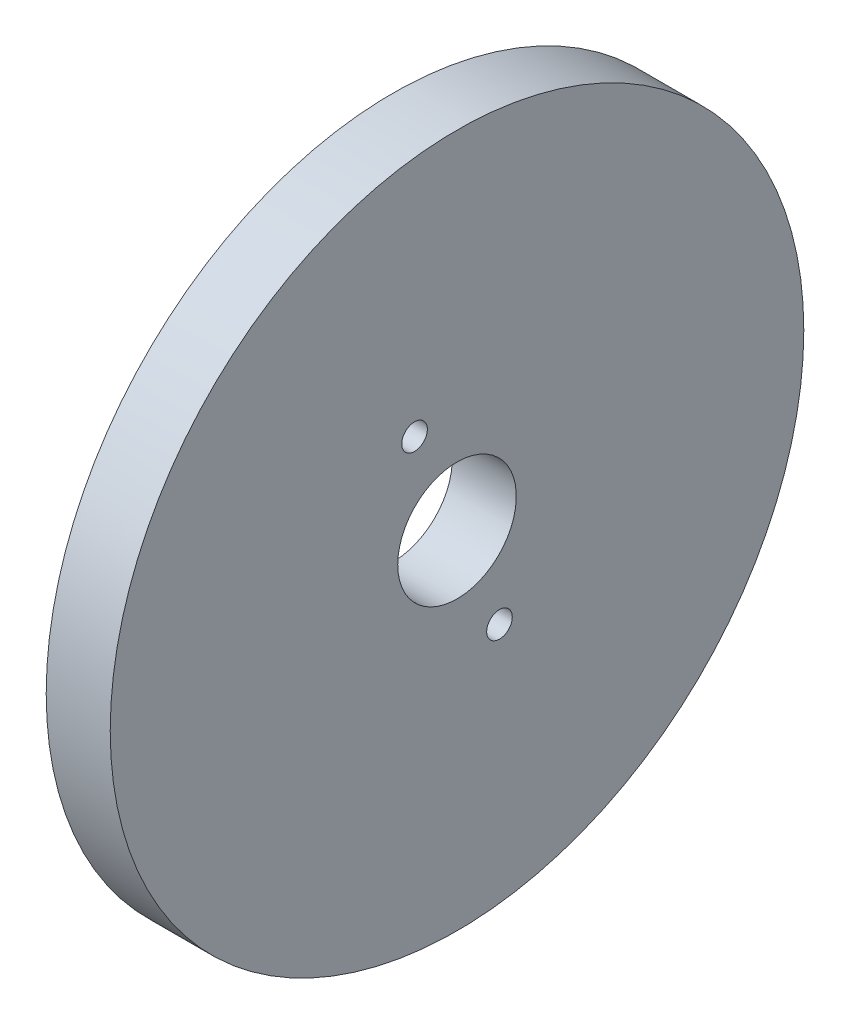
ISO-10303-21;
HEADER;
FILE_DESCRIPTION(('STEP AP214'),'2;1');
FILE_NAME('part.step','',(''),(''),'','','');
FILE_SCHEMA(('AUTOMOTIVE_DESIGN { 1 0 10303 214 1 1 1 1 }'));
ENDSEC;
DATA;
#1=APPLICATION_CONTEXT('core data for automotive mechanical design processes');
#2=APPLICATION_PROTOCOL_DEFINITION('international standard','automotive_design',2000,#1);
#3=PRODUCT_CONTEXT('',#1,'mechanical');
#4=PRODUCT('Part','Part','',(#3));
#5=PRODUCT_RELATED_PRODUCT_CATEGORY('part','',(#4));
#6=PRODUCT_DEFINITION_FORMATION('','',#4);
#7=PRODUCT_DEFINITION_CONTEXT('part definition',#1,'design');
#8=PRODUCT_DEFINITION('design','',#6,#7);
#9=PRODUCT_DEFINITION_SHAPE('','',#8);
#10=(LENGTH_UNIT() NAMED_UNIT(*) SI_UNIT(.MILLI.,.METRE.));
#11=(NAMED_UNIT(*) PLANE_ANGLE_UNIT() SI_UNIT($,.RADIAN.));
#12=(NAMED_UNIT(*) SI_UNIT($,.STERADIAN.) SOLID_ANGLE_UNIT());
#13=UNCERTAINTY_MEASURE_WITH_UNIT(LENGTH_MEASURE(1.E-05),#10,'distance_accuracy_value','');
#14=(GEOMETRIC_REPRESENTATION_CONTEXT(3) GLOBAL_UNCERTAINTY_ASSIGNED_CONTEXT((#13)) GLOBAL_UNIT_ASSIGNED_CONTEXT((#10,
#11,#12)) REPRESENTATION_CONTEXT('',''));
#15=CARTESIAN_POINT('',(0.,0.,0.));
#16=DIRECTION('',(0.,0.,1.));
#17=DIRECTION('',(1.,0.,0.));
#18=AXIS2_PLACEMENT_3D('',#15,#16,#17);
#19=CARTESIAN_POINT('',(13.7,65.,0.));
#20=DIRECTION('',(1.,0.,0.));
#21=DIRECTION('',(0.,0.,-1.));
#22=AXIS2_PLACEMENT_3D('',#19,#20,#21);
#23=PLANE('',#22);
#24=CARTESIAN_POINT('',(13.7,19.2166942762348,7.95981539319387));
#25=DIRECTION('',(1.,0.,0.));
#26=DIRECTION('',(0.,0.,-1.));
#27=AXIS2_PLACEMENT_3D('',#24,#25,#26);
#28=CIRCLE('',#27,2.4);
#29=CARTESIAN_POINT('',(13.7,19.2166942762348,5.55981539319387));
#30=VERTEX_POINT('',#29);
#31=EDGE_CURVE('E60',#30,#30,#28,.F.);
#32=ORIENTED_EDGE('',*,*,#31,.F.);
#33=EDGE_LOOP('',(#32));
#34=FACE_BOUND('',#33,.T.);
#35=CARTESIAN_POINT('',(13.7,-19.2166942762348,-7.95981539319386));
#36=DIRECTION('',(1.,0.,0.));
#37=DIRECTION('',(0.,0.,-1.));
#38=AXIS2_PLACEMENT_3D('',#35,#36,#37);
#39=CIRCLE('',#38,2.4);
#40=CARTESIAN_POINT('',(13.7,-19.2166942762348,-10.3598153931939));
#41=VERTEX_POINT('',#40);
#42=EDGE_CURVE('E64',#41,#41,#39,.F.);
#43=ORIENTED_EDGE('',*,*,#42,.F.);
#44=EDGE_LOOP('',(#43));
#45=FACE_BOUND('',#44,.T.);
#46=CARTESIAN_POINT('',(13.7,0.,0.));
#47=DIRECTION('',(-1.,0.,0.));
#48=DIRECTION('',(0.,0.,1.));
#49=AXIS2_PLACEMENT_3D('',#46,#47,#48);
#50=CIRCLE('',#49,11.1125);
#51=CARTESIAN_POINT('',(13.7,0.,11.1125));
#52=VERTEX_POINT('',#51);
#53=EDGE_CURVE('E10',#52,#52,#50,.T.);
#54=ORIENTED_EDGE('',*,*,#53,.F.);
#55=EDGE_LOOP('',(#54));
#56=FACE_BOUND('',#55,.T.);
#57=CARTESIAN_POINT('',(13.7,0.,0.));
#58=DIRECTION('',(-1.,0.,0.));
#59=DIRECTION('',(0.,0.,1.));
#60=AXIS2_PLACEMENT_3D('',#57,#58,#59);
#61=CIRCLE('',#60,65.);
#62=CARTESIAN_POINT('',(13.7,0.,65.));
#63=VERTEX_POINT('',#62);
#64=EDGE_CURVE('E54',#63,#63,#61,.T.);
#65=ORIENTED_EDGE('',*,*,#64,.T.);
#66=EDGE_LOOP('',(#65));
#67=FACE_BOUND('',#66,.T.);
#68=ADVANCED_FACE('F37',(#34,#45,#56,#67),#23,.F.);
#69=CARTESIAN_POINT('',(-110.,0.,0.));
#70=DIRECTION('',(-1.,0.,0.));
#71=DIRECTION('',(0.,0.,1.));
#72=AXIS2_PLACEMENT_3D('',#69,#70,#71);
#73=CYLINDRICAL_SURFACE('',#72,11.1125);
#74=CARTESIAN_POINT('',(25.7,0.,0.));
#75=DIRECTION('',(-1.,0.,0.));
#76=DIRECTION('',(0.,0.,1.));
#77=AXIS2_PLACEMENT_3D('',#74,#75,#76);
#78=CIRCLE('',#77,11.1125);
#79=CARTESIAN_POINT('',(25.7,0.,11.1125));
#80=VERTEX_POINT('',#79);
#81=EDGE_CURVE('E44',#80,#80,#78,.T.);
#82=ORIENTED_EDGE('',*,*,#81,.F.);
#83=EDGE_LOOP('',(#82));
#84=FACE_BOUND('',#83,.T.);
#85=ORIENTED_EDGE('',*,*,#53,.T.);
#86=EDGE_LOOP('',(#85));
#87=FACE_BOUND('',#86,.T.);
#88=ADVANCED_FACE('F84',(#84,#87),#73,.F.);
#89=CARTESIAN_POINT('',(25.7,11.1125,0.));
#90=DIRECTION('',(-1.,0.,0.));
#91=DIRECTION('',(0.,0.,1.));
#92=AXIS2_PLACEMENT_3D('',#89,#90,#91);
#93=PLANE('',#92);
#94=CARTESIAN_POINT('',(25.7,19.2166942762348,7.95981539319387));
#95=DIRECTION('',(1.,0.,0.));
#96=DIRECTION('',(0.,0.,-1.));
#97=AXIS2_PLACEMENT_3D('',#94,#95,#96);
#98=CIRCLE('',#97,2.4);
#99=CARTESIAN_POINT('',(25.7,19.2166942762348,5.55981539319387));
#100=VERTEX_POINT('',#99);
#101=EDGE_CURVE('E68',#100,#100,#98,.T.);
#102=ORIENTED_EDGE('',*,*,#101,.F.);
#103=EDGE_LOOP('',(#102));
#104=FACE_BOUND('',#103,.T.);
#105=CARTESIAN_POINT('',(25.7,-19.2166942762348,-7.95981539319386));
#106=DIRECTION('',(1.,0.,0.));
#107=DIRECTION('',(0.,0.,-1.));
#108=AXIS2_PLACEMENT_3D('',#105,#106,#107);
#109=CIRCLE('',#108,2.4);
#110=CARTESIAN_POINT('',(25.7,-19.2166942762348,-10.3598153931939));
#111=VERTEX_POINT('',#110);
#112=EDGE_CURVE('E69',#111,#111,#109,.T.);
#113=ORIENTED_EDGE('',*,*,#112,.F.);
#114=EDGE_LOOP('',(#113));
#115=FACE_BOUND('',#114,.T.);
#116=CARTESIAN_POINT('',(25.7,0.,0.));
#117=DIRECTION('',(-1.,0.,0.));
#118=DIRECTION('',(0.,0.,1.));
#119=AXIS2_PLACEMENT_3D('',#116,#117,#118);
#120=CIRCLE('',#119,65.);
#121=CARTESIAN_POINT('',(25.7,0.,65.));
#122=VERTEX_POINT('',#121);
#123=EDGE_CURVE('E49',#122,#122,#120,.T.);
#124=ORIENTED_EDGE('',*,*,#123,.F.);
#125=EDGE_LOOP('',(#124));
#126=FACE_BOUND('',#125,.T.);
#127=ORIENTED_EDGE('',*,*,#81,.T.);
#128=EDGE_LOOP('',(#127));
#129=FACE_BOUND('',#128,.T.);
#130=ADVANCED_FACE('F80',(#104,#115,#126,#129),#93,.F.);
#131=CARTESIAN_POINT('',(-110.,0.,0.));
#132=DIRECTION('',(-1.,0.,0.));
#133=DIRECTION('',(0.,0.,1.));
#134=AXIS2_PLACEMENT_3D('',#131,#132,#133);
#135=CYLINDRICAL_SURFACE('',#134,65.);
#136=ORIENTED_EDGE('',*,*,#64,.F.);
#137=EDGE_LOOP('',(#136));
#138=FACE_BOUND('',#137,.T.);
#139=ORIENTED_EDGE('',*,*,#123,.T.);
#140=EDGE_LOOP('',(#139));
#141=FACE_BOUND('',#140,.T.);
#142=ADVANCED_FACE('F83',(#138,#141),#135,.T.);
#143=CARTESIAN_POINT('',(25.7,-19.2166942762348,-7.95981539319386));
#144=DIRECTION('',(-1.,0.,0.));
#145=DIRECTION('',(0.,0.,1.));
#146=AXIS2_PLACEMENT_3D('',#143,#144,#145);
#147=CYLINDRICAL_SURFACE('',#146,2.4);
#148=ORIENTED_EDGE('',*,*,#112,.T.);
#149=EDGE_LOOP('',(#148));
#150=FACE_BOUND('',#149,.T.);
#151=ORIENTED_EDGE('',*,*,#42,.T.);
#152=EDGE_LOOP('',(#151));
#153=FACE_BOUND('',#152,.T.);
#154=ADVANCED_FACE('F91',(#150,#153),#147,.F.);
#155=CARTESIAN_POINT('',(25.7,19.2166942762348,7.95981539319387));
#156=DIRECTION('',(-1.,0.,0.));
#157=DIRECTION('',(0.,0.,1.));
#158=AXIS2_PLACEMENT_3D('',#155,#156,#157);
#159=CYLINDRICAL_SURFACE('',#158,2.4);
#160=ORIENTED_EDGE('',*,*,#101,.T.);
#161=EDGE_LOOP('',(#160));
#162=FACE_BOUND('',#161,.T.);
#163=ORIENTED_EDGE('',*,*,#31,.T.);
#164=EDGE_LOOP('',(#163));
#165=FACE_BOUND('',#164,.T.);
#166=ADVANCED_FACE('F77',(#162,#165),#159,.F.);
#167=CLOSED_SHELL('',(#68,#88,#130,#142,#154,#166));
#168=MANIFOLD_SOLID_BREP('B2',#167);
#169=ADVANCED_BREP_SHAPE_REPRESENTATION('',(#18,#168),#14);
#170=SHAPE_DEFINITION_REPRESENTATION(#9,#169);
ENDSEC;
END-ISO-10303-21;
